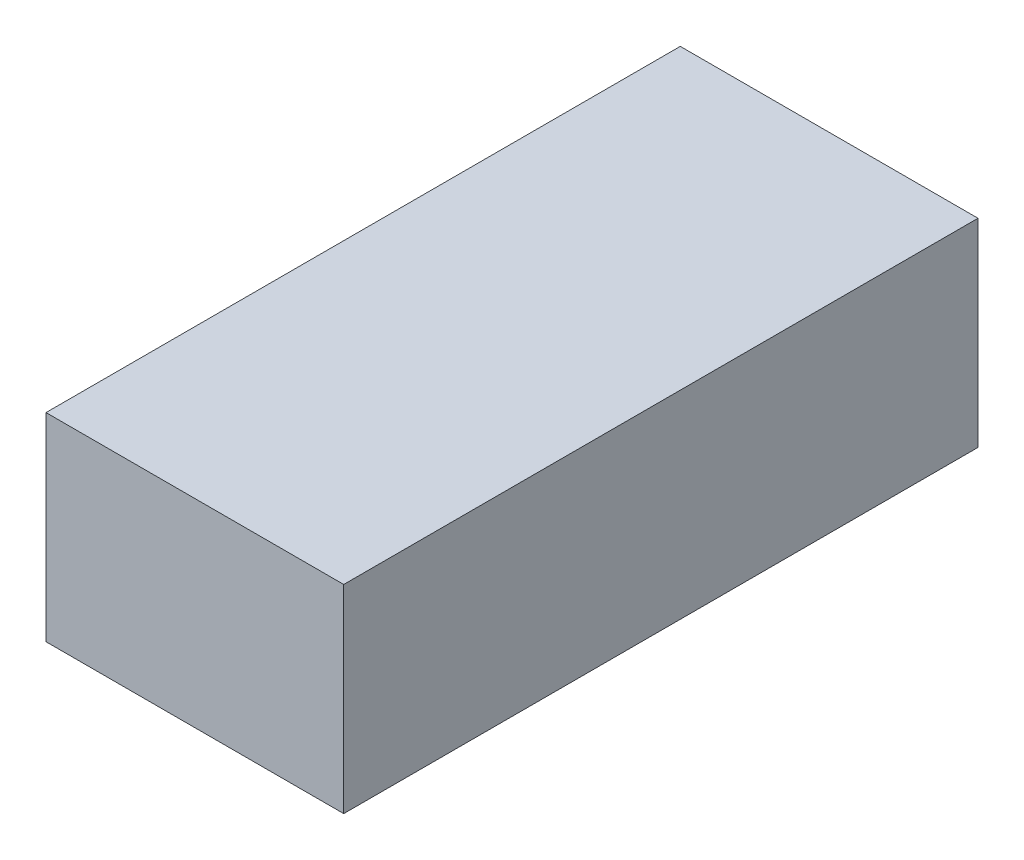
ISO-10303-21;
HEADER;
FILE_DESCRIPTION(('STEP AP214'),'2;1');
FILE_NAME('part.step','',(''),(''),'','','');
FILE_SCHEMA(('AUTOMOTIVE_DESIGN { 1 0 10303 214 1 1 1 1 }'));
ENDSEC;
DATA;
#1=APPLICATION_CONTEXT('core data for automotive mechanical design processes');
#2=APPLICATION_PROTOCOL_DEFINITION('international standard','automotive_design',2000,#1);
#3=PRODUCT_CONTEXT('',#1,'mechanical');
#4=PRODUCT('Part','Part','',(#3));
#5=PRODUCT_RELATED_PRODUCT_CATEGORY('part','',(#4));
#6=PRODUCT_DEFINITION_FORMATION('','',#4);
#7=PRODUCT_DEFINITION_CONTEXT('part definition',#1,'design');
#8=PRODUCT_DEFINITION('design','',#6,#7);
#9=PRODUCT_DEFINITION_SHAPE('','',#8);
#10=(LENGTH_UNIT() NAMED_UNIT(*) SI_UNIT(.MILLI.,.METRE.));
#11=(NAMED_UNIT(*) PLANE_ANGLE_UNIT() SI_UNIT($,.RADIAN.));
#12=(NAMED_UNIT(*) SI_UNIT($,.STERADIAN.) SOLID_ANGLE_UNIT());
#13=UNCERTAINTY_MEASURE_WITH_UNIT(LENGTH_MEASURE(1.E-05),#10,'distance_accuracy_value','');
#14=(GEOMETRIC_REPRESENTATION_CONTEXT(3) GLOBAL_UNCERTAINTY_ASSIGNED_CONTEXT((#13)) GLOBAL_UNIT_ASSIGNED_CONTEXT((#10,
#11,#12)) REPRESENTATION_CONTEXT('',''));
#15=CARTESIAN_POINT('',(0.,0.,0.));
#16=DIRECTION('',(0.,0.,1.));
#17=DIRECTION('',(1.,0.,0.));
#18=AXIS2_PLACEMENT_3D('',#15,#16,#17);
#19=CARTESIAN_POINT('',(17.250029,-11.5000024,36.74999));
#20=DIRECTION('',(-1.,0.,0.));
#21=DIRECTION('',(0.,0.,1.));
#22=AXIS2_PLACEMENT_3D('',#19,#20,#21);
#23=PLANE('',#22);
#24=DIRECTION('',(0.,1.,0.));
#25=VECTOR('',#24,1.);
#26=CARTESIAN_POINT('',(17.250029,-11.5000024,-36.74999));
#27=LINE('',#26,#25);
#28=CARTESIAN_POINT('',(17.250029,-11.5000024,-36.74999));
#29=VERTEX_POINT('',#28);
#30=CARTESIAN_POINT('',(17.250029,11.5000024,-36.74999));
#31=VERTEX_POINT('',#30);
#32=EDGE_CURVE('E96',#29,#31,#27,.T.);
#33=ORIENTED_EDGE('',*,*,#32,.T.);
#34=DIRECTION('',(0.,0.,-1.));
#35=VECTOR('',#34,1.);
#36=CARTESIAN_POINT('',(17.250029,11.5000024,36.74999));
#37=LINE('',#36,#35);
#38=CARTESIAN_POINT('',(17.250029,11.5000024,36.74999));
#39=VERTEX_POINT('',#38);
#40=EDGE_CURVE('E11',#39,#31,#37,.T.);
#41=ORIENTED_EDGE('',*,*,#40,.F.);
#42=DIRECTION('',(0.,1.,0.));
#43=VECTOR('',#42,1.);
#44=CARTESIAN_POINT('',(17.250029,-11.5000024,36.74999));
#45=LINE('',#44,#43);
#46=CARTESIAN_POINT('',(17.250029,-11.5000024,36.74999));
#47=VERTEX_POINT('',#46);
#48=EDGE_CURVE('E84',#47,#39,#45,.T.);
#49=ORIENTED_EDGE('',*,*,#48,.F.);
#50=DIRECTION('',(0.,0.,-1.));
#51=VECTOR('',#50,1.);
#52=CARTESIAN_POINT('',(17.250029,-11.5000024,36.74999));
#53=LINE('',#52,#51);
#54=EDGE_CURVE('E92',#47,#29,#53,.T.);
#55=ORIENTED_EDGE('',*,*,#54,.T.);
#56=EDGE_LOOP('',(#33,#41,#49,#55));
#57=FACE_BOUND('',#56,.T.);
#58=ADVANCED_FACE('F33',(#57),#23,.F.);
#59=CARTESIAN_POINT('',(-17.250029,11.5000024,36.74999));
#60=DIRECTION('',(0.,-1.,0.));
#61=DIRECTION('',(0.,0.,-1.));
#62=AXIS2_PLACEMENT_3D('',#59,#60,#61);
#63=PLANE('',#62);
#64=DIRECTION('',(-1.,0.,0.));
#65=VECTOR('',#64,1.);
#66=CARTESIAN_POINT('',(-17.250029,11.5000024,-36.74999));
#67=LINE('',#66,#65);
#68=CARTESIAN_POINT('',(-17.250029,11.5000024,-36.74999));
#69=VERTEX_POINT('',#68);
#70=EDGE_CURVE('E88',#31,#69,#67,.T.);
#71=ORIENTED_EDGE('',*,*,#70,.T.);
#72=DIRECTION('',(0.,0.,-1.));
#73=VECTOR('',#72,1.);
#74=CARTESIAN_POINT('',(-17.250029,11.5000024,36.74999));
#75=LINE('',#74,#73);
#76=CARTESIAN_POINT('',(-17.250029,11.5000024,36.74999));
#77=VERTEX_POINT('',#76);
#78=EDGE_CURVE('E41',#77,#69,#75,.T.);
#79=ORIENTED_EDGE('',*,*,#78,.F.);
#80=DIRECTION('',(-1.,0.,0.));
#81=VECTOR('',#80,1.);
#82=CARTESIAN_POINT('',(-17.250029,11.5000024,36.74999));
#83=LINE('',#82,#81);
#84=EDGE_CURVE('E79',#39,#77,#83,.T.);
#85=ORIENTED_EDGE('',*,*,#84,.F.);
#86=ORIENTED_EDGE('',*,*,#40,.T.);
#87=EDGE_LOOP('',(#71,#79,#85,#86));
#88=FACE_BOUND('',#87,.T.);
#89=ADVANCED_FACE('F87',(#88),#63,.F.);
#90=CARTESIAN_POINT('',(-17.250029,-11.5000024,36.74999));
#91=DIRECTION('',(1.,0.,0.));
#92=DIRECTION('',(0.,0.,-1.));
#93=AXIS2_PLACEMENT_3D('',#90,#91,#92);
#94=PLANE('',#93);
#95=DIRECTION('',(0.,-1.,0.));
#96=VECTOR('',#95,1.);
#97=CARTESIAN_POINT('',(-17.250029,-11.5000024,-36.74999));
#98=LINE('',#97,#96);
#99=CARTESIAN_POINT('',(-17.250029,-11.5000024,-36.74999));
#100=VERTEX_POINT('',#99);
#101=EDGE_CURVE('E66',#69,#100,#98,.T.);
#102=ORIENTED_EDGE('',*,*,#101,.T.);
#103=DIRECTION('',(0.,0.,-1.));
#104=VECTOR('',#103,1.);
#105=CARTESIAN_POINT('',(-17.250029,-11.5000024,36.74999));
#106=LINE('',#105,#104);
#107=CARTESIAN_POINT('',(-17.250029,-11.5000024,36.74999));
#108=VERTEX_POINT('',#107);
#109=EDGE_CURVE('E89',#108,#100,#106,.T.);
#110=ORIENTED_EDGE('',*,*,#109,.F.);
#111=DIRECTION('',(0.,-1.,0.));
#112=VECTOR('',#111,1.);
#113=CARTESIAN_POINT('',(-17.250029,-11.5000024,36.74999));
#114=LINE('',#113,#112);
#115=EDGE_CURVE('E82',#77,#108,#114,.T.);
#116=ORIENTED_EDGE('',*,*,#115,.F.);
#117=ORIENTED_EDGE('',*,*,#78,.T.);
#118=EDGE_LOOP('',(#102,#110,#116,#117));
#119=FACE_BOUND('',#118,.T.);
#120=ADVANCED_FACE('F90',(#119),#94,.F.);
#121=CARTESIAN_POINT('',(-17.250029,-11.5000024,36.74999));
#122=DIRECTION('',(0.,1.,0.));
#123=DIRECTION('',(0.,0.,1.));
#124=AXIS2_PLACEMENT_3D('',#121,#122,#123);
#125=PLANE('',#124);
#126=DIRECTION('',(1.,0.,0.));
#127=VECTOR('',#126,1.);
#128=CARTESIAN_POINT('',(-17.250029,-11.5000024,-36.74999));
#129=LINE('',#128,#127);
#130=EDGE_CURVE('E72',#100,#29,#129,.T.);
#131=ORIENTED_EDGE('',*,*,#130,.T.);
#132=ORIENTED_EDGE('',*,*,#54,.F.);
#133=DIRECTION('',(1.,0.,0.));
#134=VECTOR('',#133,1.);
#135=CARTESIAN_POINT('',(-17.250029,-11.5000024,36.74999));
#136=LINE('',#135,#134);
#137=EDGE_CURVE('E49',#108,#47,#136,.T.);
#138=ORIENTED_EDGE('',*,*,#137,.F.);
#139=ORIENTED_EDGE('',*,*,#109,.T.);
#140=EDGE_LOOP('',(#131,#132,#138,#139));
#141=FACE_BOUND('',#140,.T.);
#142=ADVANCED_FACE('F103',(#141),#125,.F.);
#143=CARTESIAN_POINT('',(0.,0.,36.74999));
#144=DIRECTION('',(0.,0.,-1.));
#145=DIRECTION('',(-1.,0.,0.));
#146=AXIS2_PLACEMENT_3D('',#143,#144,#145);
#147=PLANE('',#146);
#148=ORIENTED_EDGE('',*,*,#48,.T.);
#149=ORIENTED_EDGE('',*,*,#84,.T.);
#150=ORIENTED_EDGE('',*,*,#115,.T.);
#151=ORIENTED_EDGE('',*,*,#137,.T.);
#152=EDGE_LOOP('',(#148,#149,#150,#151));
#153=FACE_BOUND('',#152,.T.);
#154=ADVANCED_FACE('F80',(#153),#147,.F.);
#155=CARTESIAN_POINT('',(0.,0.,-36.74999));
#156=DIRECTION('',(0.,0.,-1.));
#157=DIRECTION('',(-1.,0.,0.));
#158=AXIS2_PLACEMENT_3D('',#155,#156,#157);
#159=PLANE('',#158);
#160=ORIENTED_EDGE('',*,*,#32,.F.);
#161=ORIENTED_EDGE('',*,*,#130,.F.);
#162=ORIENTED_EDGE('',*,*,#101,.F.);
#163=ORIENTED_EDGE('',*,*,#70,.F.);
#164=EDGE_LOOP('',(#160,#161,#162,#163));
#165=FACE_BOUND('',#164,.T.);
#166=ADVANCED_FACE('F106',(#165),#159,.T.);
#167=CLOSED_SHELL('',(#58,#89,#120,#142,#154,#166));
#168=MANIFOLD_SOLID_BREP('B2',#167);
#169=ADVANCED_BREP_SHAPE_REPRESENTATION('',(#18,#168),#14);
#170=SHAPE_DEFINITION_REPRESENTATION(#9,#169);
ENDSEC;
END-ISO-10303-21;
